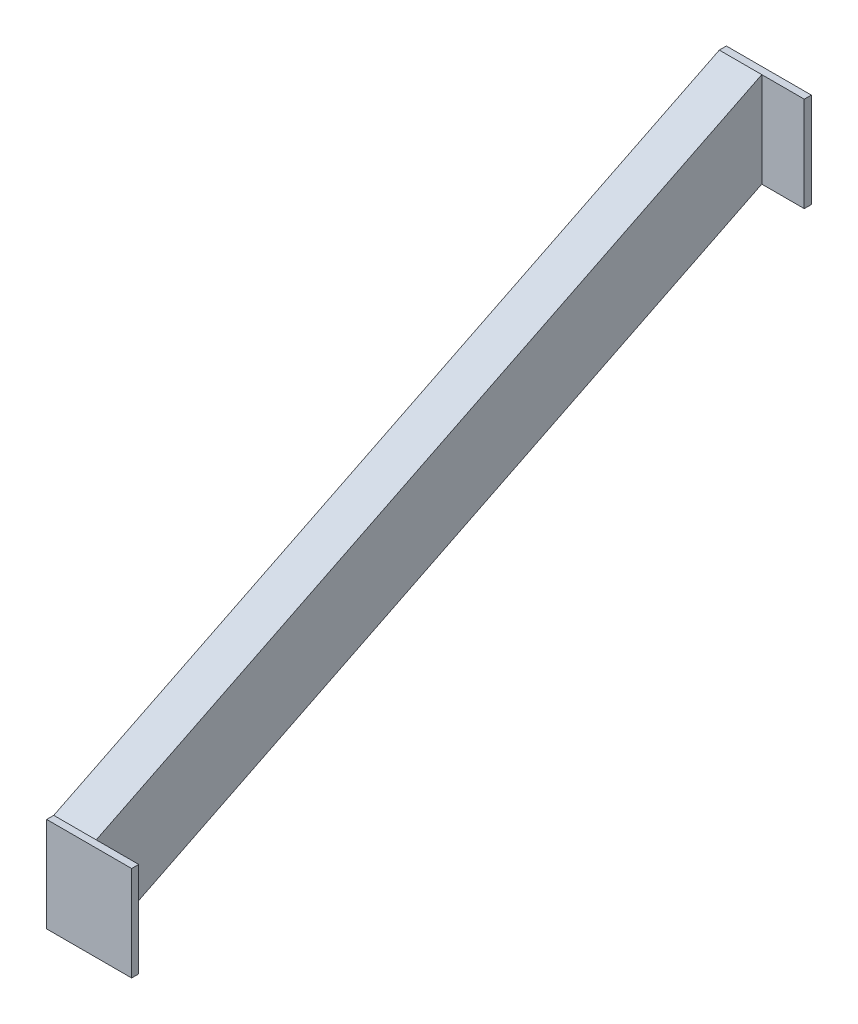
ISO-10303-21;
HEADER;
FILE_DESCRIPTION(('STEP AP214'),'2;1');
FILE_NAME('part.step','',(''),(''),'','','');
FILE_SCHEMA(('AUTOMOTIVE_DESIGN { 1 0 10303 214 1 1 1 1 }'));
ENDSEC;
DATA;
#1=APPLICATION_CONTEXT('core data for automotive mechanical design processes');
#2=APPLICATION_PROTOCOL_DEFINITION('international standard','automotive_design',2000,#1);
#3=PRODUCT_CONTEXT('',#1,'mechanical');
#4=PRODUCT('Part','Part','',(#3));
#5=PRODUCT_RELATED_PRODUCT_CATEGORY('part','',(#4));
#6=PRODUCT_DEFINITION_FORMATION('','',#4);
#7=PRODUCT_DEFINITION_CONTEXT('part definition',#1,'design');
#8=PRODUCT_DEFINITION('design','',#6,#7);
#9=PRODUCT_DEFINITION_SHAPE('','',#8);
#10=(LENGTH_UNIT() NAMED_UNIT(*) SI_UNIT(.MILLI.,.METRE.));
#11=(NAMED_UNIT(*) PLANE_ANGLE_UNIT() SI_UNIT($,.RADIAN.));
#12=(NAMED_UNIT(*) SI_UNIT($,.STERADIAN.) SOLID_ANGLE_UNIT());
#13=UNCERTAINTY_MEASURE_WITH_UNIT(LENGTH_MEASURE(1.E-05),#10,'distance_accuracy_value','');
#14=(GEOMETRIC_REPRESENTATION_CONTEXT(3) GLOBAL_UNCERTAINTY_ASSIGNED_CONTEXT((#13)) GLOBAL_UNIT_ASSIGNED_CONTEXT((#10,
#11,#12)) REPRESENTATION_CONTEXT('',''));
#15=CARTESIAN_POINT('',(0.,0.,0.));
#16=DIRECTION('',(0.,0.,1.));
#17=DIRECTION('',(1.,0.,0.));
#18=AXIS2_PLACEMENT_3D('',#15,#16,#17);
#19=CARTESIAN_POINT('',(76.2,591.896325888014,-1193.8));
#20=DIRECTION('',(0.,0.895924210900166,0.444206943127766));
#21=DIRECTION('',(0.,-0.444206943127766,0.895924210900166));
#22=AXIS2_PLACEMENT_3D('',#19,#20,#21);
#23=PLANE('',#22);
#24=DIRECTION('',(0.,0.444206943127766,-0.895924210900166));
#25=VECTOR('',#24,1.);
#26=CARTESIAN_POINT('',(0.,591.896325888014,-1193.8));
#27=LINE('',#26,#25);
#28=CARTESIAN_POINT('',(0.,0.,0.));
#29=VERTEX_POINT('',#28);
#30=CARTESIAN_POINT('',(0.,591.896325888014,-1193.8));
#31=VERTEX_POINT('',#30);
#32=EDGE_CURVE('E129',#29,#31,#27,.T.);
#33=ORIENTED_EDGE('',*,*,#32,.T.);
#34=DIRECTION('',(-1.,0.,0.));
#35=VECTOR('',#34,1.);
#36=CARTESIAN_POINT('',(76.2,591.896325888014,-1193.8));
#37=LINE('',#36,#35);
#38=CARTESIAN_POINT('',(76.2,591.896325888014,-1193.8));
#39=VERTEX_POINT('',#38);
#40=EDGE_CURVE('E11',#39,#31,#37,.T.);
#41=ORIENTED_EDGE('',*,*,#40,.F.);
#42=DIRECTION('',(0.,0.444206943127766,-0.895924210900166));
#43=VECTOR('',#42,1.);
#44=CARTESIAN_POINT('',(76.2,591.896325888014,-1193.8));
#45=LINE('',#44,#43);
#46=CARTESIAN_POINT('',(76.2,0.,0.));
#47=VERTEX_POINT('',#46);
#48=EDGE_CURVE('E161',#47,#39,#45,.T.);
#49=ORIENTED_EDGE('',*,*,#48,.F.);
#50=DIRECTION('',(-1.,0.,0.));
#51=VECTOR('',#50,1.);
#52=CARTESIAN_POINT('',(76.2,0.,0.));
#53=LINE('',#52,#51);
#54=EDGE_CURVE('E46',#47,#29,#53,.T.);
#55=ORIENTED_EDGE('',*,*,#54,.T.);
#56=EDGE_LOOP('',(#33,#41,#49,#55));
#57=FACE_BOUND('',#56,.T.);
#58=ADVANCED_FACE('F32',(#57),#23,.F.);
#59=CARTESIAN_POINT('',(76.2,170.103674111986,0.));
#60=DIRECTION('',(0.,-0.895924210900166,-0.444206943127766));
#61=DIRECTION('',(0.,0.444206943127766,-0.895924210900166));
#62=AXIS2_PLACEMENT_3D('',#59,#60,#61);
#63=PLANE('',#62);
#64=DIRECTION('',(0.,-0.444206943127766,0.895924210900166));
#65=VECTOR('',#64,1.);
#66=CARTESIAN_POINT('',(0.,170.103674111986,0.));
#67=LINE('',#66,#65);
#68=CARTESIAN_POINT('',(0.,762.,-1193.8));
#69=VERTEX_POINT('',#68);
#70=CARTESIAN_POINT('',(0.,170.103674111986,0.));
#71=VERTEX_POINT('',#70);
#72=EDGE_CURVE('E165',#69,#71,#67,.T.);
#73=ORIENTED_EDGE('',*,*,#72,.T.);
#74=DIRECTION('',(-1.,0.,0.));
#75=VECTOR('',#74,1.);
#76=CARTESIAN_POINT('',(76.2,170.103674111986,0.));
#77=LINE('',#76,#75);
#78=CARTESIAN_POINT('',(76.2,170.103674111986,0.));
#79=VERTEX_POINT('',#78);
#80=EDGE_CURVE('E178',#79,#71,#77,.T.);
#81=ORIENTED_EDGE('',*,*,#80,.F.);
#82=DIRECTION('',(0.,-0.444206943127766,0.895924210900166));
#83=VECTOR('',#82,1.);
#84=CARTESIAN_POINT('',(76.2,170.103674111986,0.));
#85=LINE('',#84,#83);
#86=CARTESIAN_POINT('',(76.2,762.,-1193.8));
#87=VERTEX_POINT('',#86);
#88=EDGE_CURVE('E168',#87,#79,#85,.T.);
#89=ORIENTED_EDGE('',*,*,#88,.F.);
#90=DIRECTION('',(-1.,0.,0.));
#91=VECTOR('',#90,1.);
#92=CARTESIAN_POINT('',(76.2,762.,-1193.8));
#93=LINE('',#92,#91);
#94=EDGE_CURVE('E39',#87,#69,#93,.T.);
#95=ORIENTED_EDGE('',*,*,#94,.T.);
#96=EDGE_LOOP('',(#73,#81,#89,#95));
#97=FACE_BOUND('',#96,.T.);
#98=ADVANCED_FACE('F182',(#97),#63,.F.);
#99=CARTESIAN_POINT('',(76.2,0.,0.));
#100=DIRECTION('',(-1.,0.,0.));
#101=DIRECTION('',(0.,0.,1.));
#102=AXIS2_PLACEMENT_3D('',#99,#100,#101);
#103=PLANE('',#102);
#104=ORIENTED_EDGE('',*,*,#48,.T.);
#105=DIRECTION('',(0.,1.,0.));
#106=VECTOR('',#105,1.);
#107=CARTESIAN_POINT('',(76.2,762.,-1193.8));
#108=LINE('',#107,#106);
#109=EDGE_CURVE('E164',#39,#87,#108,.T.);
#110=ORIENTED_EDGE('',*,*,#109,.T.);
#111=ORIENTED_EDGE('',*,*,#88,.T.);
#112=DIRECTION('',(0.,-1.,0.));
#113=VECTOR('',#112,1.);
#114=CARTESIAN_POINT('',(76.2,0.,0.));
#115=LINE('',#114,#113);
#116=EDGE_CURVE('E171',#79,#47,#115,.T.);
#117=ORIENTED_EDGE('',*,*,#116,.T.);
#118=EDGE_LOOP('',(#104,#110,#111,#117));
#119=FACE_BOUND('',#118,.T.);
#120=ADVANCED_FACE('F218',(#119),#103,.F.);
#121=CARTESIAN_POINT('',(0.,0.,0.));
#122=DIRECTION('',(-1.,0.,0.));
#123=DIRECTION('',(0.,0.,1.));
#124=AXIS2_PLACEMENT_3D('',#121,#122,#123);
#125=PLANE('',#124);
#126=ORIENTED_EDGE('',*,*,#32,.F.);
#127=DIRECTION('',(0.,0.,-1.));
#128=VECTOR('',#127,1.);
#129=CARTESIAN_POINT('',(0.,0.,12.7));
#130=LINE('',#129,#128);
#131=CARTESIAN_POINT('',(0.,0.,12.7));
#132=VERTEX_POINT('',#131);
#133=EDGE_CURVE('E108',#132,#29,#130,.T.);
#134=ORIENTED_EDGE('',*,*,#133,.F.);
#135=DIRECTION('',(0.,-1.,0.));
#136=VECTOR('',#135,1.);
#137=CARTESIAN_POINT('',(0.,0.,12.7));
#138=LINE('',#137,#136);
#139=CARTESIAN_POINT('',(0.,170.103674111986,12.7));
#140=VERTEX_POINT('',#139);
#141=EDGE_CURVE('E114',#140,#132,#138,.T.);
#142=ORIENTED_EDGE('',*,*,#141,.F.);
#143=DIRECTION('',(0.,0.,-1.));
#144=VECTOR('',#143,1.);
#145=CARTESIAN_POINT('',(0.,170.103674111986,12.7));
#146=LINE('',#145,#144);
#147=EDGE_CURVE('E186',#140,#71,#146,.T.);
#148=ORIENTED_EDGE('',*,*,#147,.T.);
#149=ORIENTED_EDGE('',*,*,#72,.F.);
#150=DIRECTION('',(0.,0.,1.));
#151=VECTOR('',#150,1.);
#152=CARTESIAN_POINT('',(0.,762.,-1206.5));
#153=LINE('',#152,#151);
#154=CARTESIAN_POINT('',(0.,762.,-1206.5));
#155=VERTEX_POINT('',#154);
#156=EDGE_CURVE('E159',#155,#69,#153,.T.);
#157=ORIENTED_EDGE('',*,*,#156,.F.);
#158=DIRECTION('',(0.,1.,0.));
#159=VECTOR('',#158,1.);
#160=CARTESIAN_POINT('',(0.,762.,-1206.5));
#161=LINE('',#160,#159);
#162=CARTESIAN_POINT('',(0.,591.896325888014,-1206.5));
#163=VERTEX_POINT('',#162);
#164=EDGE_CURVE('E138',#163,#155,#161,.T.);
#165=ORIENTED_EDGE('',*,*,#164,.F.);
#166=DIRECTION('',(0.,0.,1.));
#167=VECTOR('',#166,1.);
#168=CARTESIAN_POINT('',(0.,591.896325888014,-1206.5));
#169=LINE('',#168,#167);
#170=EDGE_CURVE('E147',#163,#31,#169,.T.);
#171=ORIENTED_EDGE('',*,*,#170,.T.);
#172=EDGE_LOOP('',(#126,#134,#142,#148,#149,#157,#165,#171));
#173=FACE_BOUND('',#172,.T.);
#174=ADVANCED_FACE('F126',(#173),#125,.T.);
#175=CARTESIAN_POINT('',(0.,0.,-1193.8));
#176=DIRECTION('',(0.,0.,1.));
#177=DIRECTION('',(1.,0.,0.));
#178=AXIS2_PLACEMENT_3D('',#175,#176,#177);
#179=PLANE('',#178);
#180=ORIENTED_EDGE('',*,*,#109,.F.);
#181=DIRECTION('',(-1.,0.,0.));
#182=VECTOR('',#181,1.);
#183=CARTESIAN_POINT('',(0.,591.896325888014,-1193.8));
#184=LINE('',#183,#182);
#185=CARTESIAN_POINT('',(152.4,591.896325888014,-1193.8));
#186=VERTEX_POINT('',#185);
#187=EDGE_CURVE('E142',#186,#39,#184,.T.);
#188=ORIENTED_EDGE('',*,*,#187,.F.);
#189=DIRECTION('',(0.,-1.,0.));
#190=VECTOR('',#189,1.);
#191=CARTESIAN_POINT('',(152.4,762.,-1193.8));
#192=LINE('',#191,#190);
#193=CARTESIAN_POINT('',(152.4,762.,-1193.8));
#194=VERTEX_POINT('',#193);
#195=EDGE_CURVE('E132',#194,#186,#192,.T.);
#196=ORIENTED_EDGE('',*,*,#195,.F.);
#197=DIRECTION('',(1.,0.,0.));
#198=VECTOR('',#197,1.);
#199=CARTESIAN_POINT('',(0.,762.,-1193.8));
#200=LINE('',#199,#198);
#201=EDGE_CURVE('E130',#87,#194,#200,.T.);
#202=ORIENTED_EDGE('',*,*,#201,.F.);
#203=EDGE_LOOP('',(#180,#188,#196,#202));
#204=FACE_BOUND('',#203,.T.);
#205=ADVANCED_FACE('F241',(#204),#179,.T.);
#206=CARTESIAN_POINT('',(0.,762.,-1206.5));
#207=DIRECTION('',(0.,-1.,0.));
#208=DIRECTION('',(0.,0.,-1.));
#209=AXIS2_PLACEMENT_3D('',#206,#207,#208);
#210=PLANE('',#209);
#211=ORIENTED_EDGE('',*,*,#94,.F.);
#212=ORIENTED_EDGE('',*,*,#201,.T.);
#213=DIRECTION('',(0.,0.,1.));
#214=VECTOR('',#213,1.);
#215=CARTESIAN_POINT('',(152.4,762.,-1206.5));
#216=LINE('',#215,#214);
#217=CARTESIAN_POINT('',(152.4,762.,-1206.5));
#218=VERTEX_POINT('',#217);
#219=EDGE_CURVE('E156',#218,#194,#216,.T.);
#220=ORIENTED_EDGE('',*,*,#219,.F.);
#221=DIRECTION('',(1.,0.,0.));
#222=VECTOR('',#221,1.);
#223=CARTESIAN_POINT('',(0.,762.,-1206.5));
#224=LINE('',#223,#222);
#225=EDGE_CURVE('E141',#155,#218,#224,.T.);
#226=ORIENTED_EDGE('',*,*,#225,.F.);
#227=ORIENTED_EDGE('',*,*,#156,.T.);
#228=EDGE_LOOP('',(#211,#212,#220,#226,#227));
#229=FACE_BOUND('',#228,.T.);
#230=ADVANCED_FACE('F243',(#229),#210,.F.);
#231=CARTESIAN_POINT('',(152.4,762.,-1206.5));
#232=DIRECTION('',(-1.,0.,0.));
#233=DIRECTION('',(0.,-1.,0.));
#234=AXIS2_PLACEMENT_3D('',#231,#232,#233);
#235=PLANE('',#234);
#236=ORIENTED_EDGE('',*,*,#195,.T.);
#237=DIRECTION('',(0.,0.,1.));
#238=VECTOR('',#237,1.);
#239=CARTESIAN_POINT('',(152.4,591.896325888014,-1206.5));
#240=LINE('',#239,#238);
#241=CARTESIAN_POINT('',(152.4,591.896325888014,-1206.5));
#242=VERTEX_POINT('',#241);
#243=EDGE_CURVE('E153',#242,#186,#240,.T.);
#244=ORIENTED_EDGE('',*,*,#243,.F.);
#245=DIRECTION('',(0.,-1.,0.));
#246=VECTOR('',#245,1.);
#247=CARTESIAN_POINT('',(152.4,762.,-1206.5));
#248=LINE('',#247,#246);
#249=EDGE_CURVE('E144',#218,#242,#248,.T.);
#250=ORIENTED_EDGE('',*,*,#249,.F.);
#251=ORIENTED_EDGE('',*,*,#219,.T.);
#252=EDGE_LOOP('',(#236,#244,#250,#251));
#253=FACE_BOUND('',#252,.T.);
#254=ADVANCED_FACE('F237',(#253),#235,.F.);
#255=CARTESIAN_POINT('',(0.,591.896325888014,-1206.5));
#256=DIRECTION('',(0.,1.,0.));
#257=DIRECTION('',(0.,0.,1.));
#258=AXIS2_PLACEMENT_3D('',#255,#256,#257);
#259=PLANE('',#258);
#260=ORIENTED_EDGE('',*,*,#187,.T.);
#261=ORIENTED_EDGE('',*,*,#40,.T.);
#262=ORIENTED_EDGE('',*,*,#170,.F.);
#263=DIRECTION('',(-1.,0.,0.));
#264=VECTOR('',#263,1.);
#265=CARTESIAN_POINT('',(0.,591.896325888014,-1206.5));
#266=LINE('',#265,#264);
#267=EDGE_CURVE('E146',#242,#163,#266,.T.);
#268=ORIENTED_EDGE('',*,*,#267,.F.);
#269=ORIENTED_EDGE('',*,*,#243,.T.);
#270=EDGE_LOOP('',(#260,#261,#262,#268,#269));
#271=FACE_BOUND('',#270,.T.);
#272=ADVANCED_FACE('F231',(#271),#259,.F.);
#273=CARTESIAN_POINT('',(0.,0.,-1206.5));
#274=DIRECTION('',(0.,0.,1.));
#275=DIRECTION('',(1.,0.,0.));
#276=AXIS2_PLACEMENT_3D('',#273,#274,#275);
#277=PLANE('',#276);
#278=ORIENTED_EDGE('',*,*,#164,.T.);
#279=ORIENTED_EDGE('',*,*,#225,.T.);
#280=ORIENTED_EDGE('',*,*,#249,.T.);
#281=ORIENTED_EDGE('',*,*,#267,.T.);
#282=EDGE_LOOP('',(#278,#279,#280,#281));
#283=FACE_BOUND('',#282,.T.);
#284=ADVANCED_FACE('F225',(#283),#277,.F.);
#285=CARTESIAN_POINT('',(0.,0.,0.));
#286=DIRECTION('',(0.,0.,-1.));
#287=DIRECTION('',(-1.,0.,0.));
#288=AXIS2_PLACEMENT_3D('',#285,#286,#287);
#289=PLANE('',#288);
#290=ORIENTED_EDGE('',*,*,#116,.F.);
#291=DIRECTION('',(-1.,0.,0.));
#292=VECTOR('',#291,1.);
#293=CARTESIAN_POINT('',(0.,170.103674111986,0.));
#294=LINE('',#293,#292);
#295=CARTESIAN_POINT('',(152.4,170.103674111986,0.));
#296=VERTEX_POINT('',#295);
#297=EDGE_CURVE('E123',#296,#79,#294,.T.);
#298=ORIENTED_EDGE('',*,*,#297,.F.);
#299=DIRECTION('',(0.,1.,0.));
#300=VECTOR('',#299,1.);
#301=CARTESIAN_POINT('',(152.4,0.,0.));
#302=LINE('',#301,#300);
#303=CARTESIAN_POINT('',(152.4,0.,0.));
#304=VERTEX_POINT('',#303);
#305=EDGE_CURVE('E194',#304,#296,#302,.T.);
#306=ORIENTED_EDGE('',*,*,#305,.F.);
#307=DIRECTION('',(1.,0.,0.));
#308=VECTOR('',#307,1.);
#309=CARTESIAN_POINT('',(0.,0.,0.));
#310=LINE('',#309,#308);
#311=EDGE_CURVE('E196',#47,#304,#310,.T.);
#312=ORIENTED_EDGE('',*,*,#311,.F.);
#313=EDGE_LOOP('',(#290,#298,#306,#312));
#314=FACE_BOUND('',#313,.T.);
#315=ADVANCED_FACE('F223',(#314),#289,.T.);
#316=CARTESIAN_POINT('',(0.,0.,12.7));
#317=DIRECTION('',(0.,1.,0.));
#318=DIRECTION('',(0.,0.,1.));
#319=AXIS2_PLACEMENT_3D('',#316,#317,#318);
#320=PLANE('',#319);
#321=ORIENTED_EDGE('',*,*,#54,.F.);
#322=ORIENTED_EDGE('',*,*,#311,.T.);
#323=DIRECTION('',(0.,0.,-1.));
#324=VECTOR('',#323,1.);
#325=CARTESIAN_POINT('',(152.4,0.,12.7));
#326=LINE('',#325,#324);
#327=CARTESIAN_POINT('',(152.4,0.,12.7));
#328=VERTEX_POINT('',#327);
#329=EDGE_CURVE('E110',#328,#304,#326,.T.);
#330=ORIENTED_EDGE('',*,*,#329,.F.);
#331=DIRECTION('',(1.,0.,0.));
#332=VECTOR('',#331,1.);
#333=CARTESIAN_POINT('',(0.,0.,12.7));
#334=LINE('',#333,#332);
#335=EDGE_CURVE('E104',#132,#328,#334,.T.);
#336=ORIENTED_EDGE('',*,*,#335,.F.);
#337=ORIENTED_EDGE('',*,*,#133,.T.);
#338=EDGE_LOOP('',(#321,#322,#330,#336,#337));
#339=FACE_BOUND('',#338,.T.);
#340=ADVANCED_FACE('F106',(#339),#320,.F.);
#341=CARTESIAN_POINT('',(152.4,0.,12.7));
#342=DIRECTION('',(-1.,0.,0.));
#343=DIRECTION('',(0.,0.,1.));
#344=AXIS2_PLACEMENT_3D('',#341,#342,#343);
#345=PLANE('',#344);
#346=ORIENTED_EDGE('',*,*,#305,.T.);
#347=DIRECTION('',(0.,0.,-1.));
#348=VECTOR('',#347,1.);
#349=CARTESIAN_POINT('',(152.4,170.103674111986,12.7));
#350=LINE('',#349,#348);
#351=CARTESIAN_POINT('',(152.4,170.103674111986,12.7));
#352=VERTEX_POINT('',#351);
#353=EDGE_CURVE('E134',#352,#296,#350,.T.);
#354=ORIENTED_EDGE('',*,*,#353,.F.);
#355=DIRECTION('',(0.,1.,0.));
#356=VECTOR('',#355,1.);
#357=CARTESIAN_POINT('',(152.4,0.,12.7));
#358=LINE('',#357,#356);
#359=EDGE_CURVE('E113',#328,#352,#358,.T.);
#360=ORIENTED_EDGE('',*,*,#359,.F.);
#361=ORIENTED_EDGE('',*,*,#329,.T.);
#362=EDGE_LOOP('',(#346,#354,#360,#361));
#363=FACE_BOUND('',#362,.T.);
#364=ADVANCED_FACE('F200',(#363),#345,.F.);
#365=CARTESIAN_POINT('',(0.,170.103674111986,12.7));
#366=DIRECTION('',(0.,-1.,0.));
#367=DIRECTION('',(0.,0.,-1.));
#368=AXIS2_PLACEMENT_3D('',#365,#366,#367);
#369=PLANE('',#368);
#370=ORIENTED_EDGE('',*,*,#297,.T.);
#371=ORIENTED_EDGE('',*,*,#80,.T.);
#372=ORIENTED_EDGE('',*,*,#147,.F.);
#373=DIRECTION('',(-1.,0.,0.));
#374=VECTOR('',#373,1.);
#375=CARTESIAN_POINT('',(0.,170.103674111986,12.7));
#376=LINE('',#375,#374);
#377=EDGE_CURVE('E119',#352,#140,#376,.T.);
#378=ORIENTED_EDGE('',*,*,#377,.F.);
#379=ORIENTED_EDGE('',*,*,#353,.T.);
#380=EDGE_LOOP('',(#370,#371,#372,#378,#379));
#381=FACE_BOUND('',#380,.T.);
#382=ADVANCED_FACE('F203',(#381),#369,.F.);
#383=CARTESIAN_POINT('',(0.,0.,12.7));
#384=DIRECTION('',(0.,0.,-1.));
#385=DIRECTION('',(-1.,0.,0.));
#386=AXIS2_PLACEMENT_3D('',#383,#384,#385);
#387=PLANE('',#386);
#388=ORIENTED_EDGE('',*,*,#141,.T.);
#389=ORIENTED_EDGE('',*,*,#335,.T.);
#390=ORIENTED_EDGE('',*,*,#359,.T.);
#391=ORIENTED_EDGE('',*,*,#377,.T.);
#392=EDGE_LOOP('',(#388,#389,#390,#391));
#393=FACE_BOUND('',#392,.T.);
#394=ADVANCED_FACE('F117',(#393),#387,.F.);
#395=CLOSED_SHELL('',(#58,#98,#120,#174,#205,#230,#254,#272,#284,#315,#340,#364,#382,#394));
#396=MANIFOLD_SOLID_BREP('B2',#395);
#397=ADVANCED_BREP_SHAPE_REPRESENTATION('',(#18,#396),#14);
#398=SHAPE_DEFINITION_REPRESENTATION(#9,#397);
ENDSEC;
END-ISO-10303-21;
